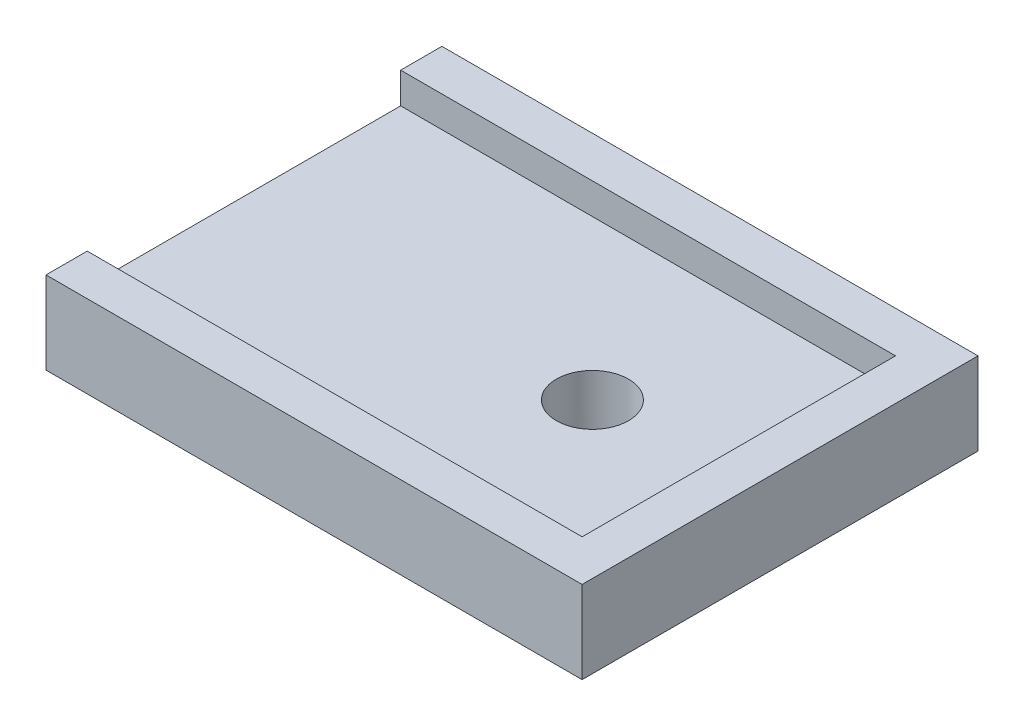
ISO-10303-21;
HEADER;
FILE_DESCRIPTION(('STEP AP214'),'2;1');
FILE_NAME('part.step','',(''),(''),'','','');
FILE_SCHEMA(('AUTOMOTIVE_DESIGN { 1 0 10303 214 1 1 1 1 }'));
ENDSEC;
DATA;
#1=APPLICATION_CONTEXT('core data for automotive mechanical design processes');
#2=APPLICATION_PROTOCOL_DEFINITION('international standard','automotive_design',2000,#1);
#3=PRODUCT_CONTEXT('',#1,'mechanical');
#4=PRODUCT('Part','Part','',(#3));
#5=PRODUCT_RELATED_PRODUCT_CATEGORY('part','',(#4));
#6=PRODUCT_DEFINITION_FORMATION('','',#4);
#7=PRODUCT_DEFINITION_CONTEXT('part definition',#1,'design');
#8=PRODUCT_DEFINITION('design','',#6,#7);
#9=PRODUCT_DEFINITION_SHAPE('','',#8);
#10=(LENGTH_UNIT() NAMED_UNIT(*) SI_UNIT(.MILLI.,.METRE.));
#11=(NAMED_UNIT(*) PLANE_ANGLE_UNIT() SI_UNIT($,.RADIAN.));
#12=(NAMED_UNIT(*) SI_UNIT($,.STERADIAN.) SOLID_ANGLE_UNIT());
#13=UNCERTAINTY_MEASURE_WITH_UNIT(LENGTH_MEASURE(1.E-05),#10,'distance_accuracy_value','');
#14=(GEOMETRIC_REPRESENTATION_CONTEXT(3) GLOBAL_UNCERTAINTY_ASSIGNED_CONTEXT((#13)) GLOBAL_UNIT_ASSIGNED_CONTEXT((#10,
#11,#12)) REPRESENTATION_CONTEXT('',''));
#15=CARTESIAN_POINT('',(0.,0.,0.));
#16=DIRECTION('',(0.,0.,1.));
#17=DIRECTION('',(1.,0.,0.));
#18=AXIS2_PLACEMENT_3D('',#15,#16,#17);
#19=CARTESIAN_POINT('',(-12.,2.5,7.6));
#20=DIRECTION('',(1.,0.,0.));
#21=DIRECTION('',(0.,0.,-1.));
#22=AXIS2_PLACEMENT_3D('',#19,#20,#21);
#23=PLANE('',#22);
#24=DIRECTION('',(0.,0.,1.));
#25=VECTOR('',#24,1.);
#26=CARTESIAN_POINT('',(-12.,0.,7.6));
#27=LINE('',#26,#25);
#28=CARTESIAN_POINT('',(-12.,0.,-9.6));
#29=VERTEX_POINT('',#28);
#30=CARTESIAN_POINT('',(-12.,0.,9.6));
#31=VERTEX_POINT('',#30);
#32=EDGE_CURVE('E192',#29,#31,#27,.T.);
#33=ORIENTED_EDGE('',*,*,#32,.T.);
#34=DIRECTION('',(0.,-1.,0.));
#35=VECTOR('',#34,1.);
#36=CARTESIAN_POINT('',(-12.,4.,9.6));
#37=LINE('',#36,#35);
#38=CARTESIAN_POINT('',(-12.,4.,9.6));
#39=VERTEX_POINT('',#38);
#40=EDGE_CURVE('E166',#39,#31,#37,.T.);
#41=ORIENTED_EDGE('',*,*,#40,.F.);
#42=DIRECTION('',(0.,0.,-1.));
#43=VECTOR('',#42,1.);
#44=CARTESIAN_POINT('',(-12.,4.,9.6));
#45=LINE('',#44,#43);
#46=CARTESIAN_POINT('',(-12.,4.,7.6));
#47=VERTEX_POINT('',#46);
#48=EDGE_CURVE('E111',#39,#47,#45,.T.);
#49=ORIENTED_EDGE('',*,*,#48,.T.);
#50=DIRECTION('',(0.,-1.,0.));
#51=VECTOR('',#50,1.);
#52=CARTESIAN_POINT('',(-12.,4.,7.6));
#53=LINE('',#52,#51);
#54=CARTESIAN_POINT('',(-12.,2.5,7.6));
#55=VERTEX_POINT('',#54);
#56=EDGE_CURVE('E127',#47,#55,#53,.T.);
#57=ORIENTED_EDGE('',*,*,#56,.T.);
#58=DIRECTION('',(0.,0.,1.));
#59=VECTOR('',#58,1.);
#60=CARTESIAN_POINT('',(-12.,2.5,7.6));
#61=LINE('',#60,#59);
#62=CARTESIAN_POINT('',(-12.,2.5,-7.6));
#63=VERTEX_POINT('',#62);
#64=EDGE_CURVE('E48',#63,#55,#61,.T.);
#65=ORIENTED_EDGE('',*,*,#64,.F.);
#66=DIRECTION('',(0.,-1.,0.));
#67=VECTOR('',#66,1.);
#68=CARTESIAN_POINT('',(-12.,4.,-7.6));
#69=LINE('',#68,#67);
#70=CARTESIAN_POINT('',(-12.,4.,-7.6));
#71=VERTEX_POINT('',#70);
#72=EDGE_CURVE('E180',#71,#63,#69,.T.);
#73=ORIENTED_EDGE('',*,*,#72,.F.);
#74=DIRECTION('',(0.,0.,-1.));
#75=VECTOR('',#74,1.);
#76=CARTESIAN_POINT('',(-12.,4.,-7.6));
#77=LINE('',#76,#75);
#78=CARTESIAN_POINT('',(-12.,4.,-9.6));
#79=VERTEX_POINT('',#78);
#80=EDGE_CURVE('E138',#71,#79,#77,.T.);
#81=ORIENTED_EDGE('',*,*,#80,.T.);
#82=DIRECTION('',(0.,-1.,0.));
#83=VECTOR('',#82,1.);
#84=CARTESIAN_POINT('',(-12.,4.,-9.6));
#85=LINE('',#84,#83);
#86=EDGE_CURVE('E176',#79,#29,#85,.T.);
#87=ORIENTED_EDGE('',*,*,#86,.T.);
#88=EDGE_LOOP('',(#33,#41,#49,#57,#65,#73,#81,#87));
#89=FACE_BOUND('',#88,.T.);
#90=ADVANCED_FACE('F39',(#89),#23,.F.);
#91=CARTESIAN_POINT('',(0.,2.5,0.));
#92=DIRECTION('',(0.,-1.,0.));
#93=DIRECTION('',(0.,0.,-1.));
#94=AXIS2_PLACEMENT_3D('',#91,#92,#93);
#95=PLANE('',#94);
#96=CARTESIAN_POINT('',(4.99999999999999,2.5,0.0999999999999812));
#97=DIRECTION('',(0.,1.,0.));
#98=DIRECTION('',(0.,0.,1.));
#99=AXIS2_PLACEMENT_3D('',#96,#97,#98);
#100=CIRCLE('',#99,1.75);
#101=CARTESIAN_POINT('',(4.99999999999999,2.5,1.84999999999998));
#102=VERTEX_POINT('',#101);
#103=EDGE_CURVE('E165',#102,#102,#100,.T.);
#104=ORIENTED_EDGE('',*,*,#103,.F.);
#105=EDGE_LOOP('',(#104));
#106=FACE_BOUND('',#105,.T.);
#107=DIRECTION('',(0.,0.,-1.));
#108=VECTOR('',#107,1.);
#109=CARTESIAN_POINT('',(12.,2.5,7.6));
#110=LINE('',#109,#108);
#111=CARTESIAN_POINT('',(12.,2.5,7.6));
#112=VERTEX_POINT('',#111);
#113=CARTESIAN_POINT('',(12.,2.5,-7.6));
#114=VERTEX_POINT('',#113);
#115=EDGE_CURVE('E106',#112,#114,#110,.T.);
#116=ORIENTED_EDGE('',*,*,#115,.T.);
#117=DIRECTION('',(-1.,0.,0.));
#118=VECTOR('',#117,1.);
#119=CARTESIAN_POINT('',(-12.,2.5,-7.6));
#120=LINE('',#119,#118);
#121=EDGE_CURVE('E191',#114,#63,#120,.T.);
#122=ORIENTED_EDGE('',*,*,#121,.T.);
#123=ORIENTED_EDGE('',*,*,#64,.T.);
#124=DIRECTION('',(1.,0.,0.));
#125=VECTOR('',#124,1.);
#126=CARTESIAN_POINT('',(-12.,2.5,7.6));
#127=LINE('',#126,#125);
#128=EDGE_CURVE('E11',#55,#112,#127,.T.);
#129=ORIENTED_EDGE('',*,*,#128,.T.);
#130=EDGE_LOOP('',(#116,#122,#123,#129));
#131=FACE_BOUND('',#130,.T.);
#132=ADVANCED_FACE('F207',(#106,#131),#95,.F.);
#133=CARTESIAN_POINT('',(0.,0.,0.));
#134=DIRECTION('',(0.,-1.,0.));
#135=DIRECTION('',(0.,0.,-1.));
#136=AXIS2_PLACEMENT_3D('',#133,#134,#135);
#137=PLANE('',#136);
#138=ORIENTED_EDGE('',*,*,#32,.F.);
#139=DIRECTION('',(1.,0.,0.));
#140=VECTOR('',#139,1.);
#141=CARTESIAN_POINT('',(14.,0.,-9.6));
#142=LINE('',#141,#140);
#143=CARTESIAN_POINT('',(14.,0.,-9.6));
#144=VERTEX_POINT('',#143);
#145=EDGE_CURVE('E156',#29,#144,#142,.T.);
#146=ORIENTED_EDGE('',*,*,#145,.T.);
#147=DIRECTION('',(0.,0.,1.));
#148=VECTOR('',#147,1.);
#149=CARTESIAN_POINT('',(14.,0.,9.6));
#150=LINE('',#149,#148);
#151=CARTESIAN_POINT('',(14.,0.,9.6));
#152=VERTEX_POINT('',#151);
#153=EDGE_CURVE('E133',#144,#152,#150,.T.);
#154=ORIENTED_EDGE('',*,*,#153,.T.);
#155=DIRECTION('',(-1.,0.,0.));
#156=VECTOR('',#155,1.);
#157=CARTESIAN_POINT('',(-12.,0.,9.6));
#158=LINE('',#157,#156);
#159=EDGE_CURVE('E129',#152,#31,#158,.T.);
#160=ORIENTED_EDGE('',*,*,#159,.T.);
#161=EDGE_LOOP('',(#138,#146,#154,#160));
#162=FACE_BOUND('',#161,.T.);
#163=CARTESIAN_POINT('',(4.99999999999999,0.,0.0999999999999812));
#164=DIRECTION('',(0.,-1.,0.));
#165=DIRECTION('',(0.,0.,-1.));
#166=AXIS2_PLACEMENT_3D('',#163,#164,#165);
#167=CIRCLE('',#166,1.75);
#168=CARTESIAN_POINT('',(4.99999999999999,0.,-1.65000000000002));
#169=VERTEX_POINT('',#168);
#170=EDGE_CURVE('E42',#169,#169,#167,.T.);
#171=ORIENTED_EDGE('',*,*,#170,.F.);
#172=EDGE_LOOP('',(#171));
#173=FACE_BOUND('',#172,.T.);
#174=ADVANCED_FACE('F205',(#162,#173),#137,.T.);
#175=CARTESIAN_POINT('',(4.99999999999999,-7.5,0.0999999999999812));
#176=DIRECTION('',(0.,1.,0.));
#177=DIRECTION('',(0.,0.,1.));
#178=AXIS2_PLACEMENT_3D('',#175,#176,#177);
#179=CYLINDRICAL_SURFACE('',#178,1.75);
#180=ORIENTED_EDGE('',*,*,#170,.T.);
#181=EDGE_LOOP('',(#180));
#182=FACE_BOUND('',#181,.T.);
#183=ORIENTED_EDGE('',*,*,#103,.T.);
#184=EDGE_LOOP('',(#183));
#185=FACE_BOUND('',#184,.T.);
#186=ADVANCED_FACE('F202',(#182,#185),#179,.F.);
#187=CARTESIAN_POINT('',(-12.,4.,7.6));
#188=DIRECTION('',(0.,0.,-1.));
#189=DIRECTION('',(-1.,0.,0.));
#190=AXIS2_PLACEMENT_3D('',#187,#188,#189);
#191=PLANE('',#190);
#192=ORIENTED_EDGE('',*,*,#128,.F.);
#193=ORIENTED_EDGE('',*,*,#56,.F.);
#194=DIRECTION('',(1.,0.,0.));
#195=VECTOR('',#194,1.);
#196=CARTESIAN_POINT('',(-12.,4.,7.6));
#197=LINE('',#196,#195);
#198=CARTESIAN_POINT('',(12.,4.,7.6));
#199=VERTEX_POINT('',#198);
#200=EDGE_CURVE('E118',#47,#199,#197,.T.);
#201=ORIENTED_EDGE('',*,*,#200,.T.);
#202=DIRECTION('',(0.,-1.,0.));
#203=VECTOR('',#202,1.);
#204=CARTESIAN_POINT('',(12.,4.,7.6));
#205=LINE('',#204,#203);
#206=EDGE_CURVE('E101',#199,#112,#205,.T.);
#207=ORIENTED_EDGE('',*,*,#206,.T.);
#208=EDGE_LOOP('',(#192,#193,#201,#207));
#209=FACE_BOUND('',#208,.T.);
#210=ADVANCED_FACE('F125',(#209),#191,.T.);
#211=CARTESIAN_POINT('',(12.,4.,-7.6));
#212=DIRECTION('',(0.,0.,1.));
#213=DIRECTION('',(1.,0.,0.));
#214=AXIS2_PLACEMENT_3D('',#211,#212,#213);
#215=PLANE('',#214);
#216=ORIENTED_EDGE('',*,*,#121,.F.);
#217=DIRECTION('',(0.,-1.,0.));
#218=VECTOR('',#217,1.);
#219=CARTESIAN_POINT('',(12.,4.,-7.6));
#220=LINE('',#219,#218);
#221=CARTESIAN_POINT('',(12.,4.,-7.6));
#222=VERTEX_POINT('',#221);
#223=EDGE_CURVE('E110',#222,#114,#220,.T.);
#224=ORIENTED_EDGE('',*,*,#223,.F.);
#225=DIRECTION('',(-1.,0.,0.));
#226=VECTOR('',#225,1.);
#227=CARTESIAN_POINT('',(12.,4.,-7.6));
#228=LINE('',#227,#226);
#229=EDGE_CURVE('E122',#222,#71,#228,.T.);
#230=ORIENTED_EDGE('',*,*,#229,.T.);
#231=ORIENTED_EDGE('',*,*,#72,.T.);
#232=EDGE_LOOP('',(#216,#224,#230,#231));
#233=FACE_BOUND('',#232,.T.);
#234=ADVANCED_FACE('F239',(#233),#215,.T.);
#235=CARTESIAN_POINT('',(12.,4.,7.6));
#236=DIRECTION('',(-1.,0.,0.));
#237=DIRECTION('',(0.,0.,1.));
#238=AXIS2_PLACEMENT_3D('',#235,#236,#237);
#239=PLANE('',#238);
#240=ORIENTED_EDGE('',*,*,#115,.F.);
#241=ORIENTED_EDGE('',*,*,#206,.F.);
#242=DIRECTION('',(0.,0.,-1.));
#243=VECTOR('',#242,1.);
#244=CARTESIAN_POINT('',(12.,4.,7.6));
#245=LINE('',#244,#243);
#246=EDGE_CURVE('E105',#199,#222,#245,.T.);
#247=ORIENTED_EDGE('',*,*,#246,.T.);
#248=ORIENTED_EDGE('',*,*,#223,.T.);
#249=EDGE_LOOP('',(#240,#241,#247,#248));
#250=FACE_BOUND('',#249,.T.);
#251=ADVANCED_FACE('F103',(#250),#239,.T.);
#252=CARTESIAN_POINT('',(-12.,4.,9.6));
#253=DIRECTION('',(0.,0.,1.));
#254=DIRECTION('',(1.,0.,0.));
#255=AXIS2_PLACEMENT_3D('',#252,#253,#254);
#256=PLANE('',#255);
#257=ORIENTED_EDGE('',*,*,#159,.F.);
#258=DIRECTION('',(0.,-1.,0.));
#259=VECTOR('',#258,1.);
#260=CARTESIAN_POINT('',(14.,4.,9.6));
#261=LINE('',#260,#259);
#262=CARTESIAN_POINT('',(14.,4.,9.6));
#263=VERTEX_POINT('',#262);
#264=EDGE_CURVE('E170',#263,#152,#261,.T.);
#265=ORIENTED_EDGE('',*,*,#264,.F.);
#266=DIRECTION('',(-1.,0.,0.));
#267=VECTOR('',#266,1.);
#268=CARTESIAN_POINT('',(-12.,4.,9.6));
#269=LINE('',#268,#267);
#270=EDGE_CURVE('E150',#263,#39,#269,.T.);
#271=ORIENTED_EDGE('',*,*,#270,.T.);
#272=ORIENTED_EDGE('',*,*,#40,.T.);
#273=EDGE_LOOP('',(#257,#265,#271,#272));
#274=FACE_BOUND('',#273,.T.);
#275=ADVANCED_FACE('F257',(#274),#256,.T.);
#276=CARTESIAN_POINT('',(14.,4.,9.6));
#277=DIRECTION('',(1.,0.,0.));
#278=DIRECTION('',(0.,0.,-1.));
#279=AXIS2_PLACEMENT_3D('',#276,#277,#278);
#280=PLANE('',#279);
#281=ORIENTED_EDGE('',*,*,#153,.F.);
#282=DIRECTION('',(0.,-1.,0.));
#283=VECTOR('',#282,1.);
#284=CARTESIAN_POINT('',(14.,4.,-9.6));
#285=LINE('',#284,#283);
#286=CARTESIAN_POINT('',(14.,4.,-9.6));
#287=VERTEX_POINT('',#286);
#288=EDGE_CURVE('E173',#287,#144,#285,.T.);
#289=ORIENTED_EDGE('',*,*,#288,.F.);
#290=DIRECTION('',(0.,0.,1.));
#291=VECTOR('',#290,1.);
#292=CARTESIAN_POINT('',(14.,4.,9.6));
#293=LINE('',#292,#291);
#294=EDGE_CURVE('E146',#287,#263,#293,.T.);
#295=ORIENTED_EDGE('',*,*,#294,.T.);
#296=ORIENTED_EDGE('',*,*,#264,.T.);
#297=EDGE_LOOP('',(#281,#289,#295,#296));
#298=FACE_BOUND('',#297,.T.);
#299=ADVANCED_FACE('F266',(#298),#280,.T.);
#300=CARTESIAN_POINT('',(14.,4.,-9.6));
#301=DIRECTION('',(0.,0.,-1.));
#302=DIRECTION('',(-1.,0.,0.));
#303=AXIS2_PLACEMENT_3D('',#300,#301,#302);
#304=PLANE('',#303);
#305=ORIENTED_EDGE('',*,*,#145,.F.);
#306=ORIENTED_EDGE('',*,*,#86,.F.);
#307=DIRECTION('',(1.,0.,0.));
#308=VECTOR('',#307,1.);
#309=CARTESIAN_POINT('',(14.,4.,-9.6));
#310=LINE('',#309,#308);
#311=EDGE_CURVE('E142',#79,#287,#310,.T.);
#312=ORIENTED_EDGE('',*,*,#311,.T.);
#313=ORIENTED_EDGE('',*,*,#288,.T.);
#314=EDGE_LOOP('',(#305,#306,#312,#313));
#315=FACE_BOUND('',#314,.T.);
#316=ADVANCED_FACE('F276',(#315),#304,.T.);
#317=CARTESIAN_POINT('',(0.,4.,0.));
#318=DIRECTION('',(0.,1.,0.));
#319=DIRECTION('',(0.,0.,1.));
#320=AXIS2_PLACEMENT_3D('',#317,#318,#319);
#321=PLANE('',#320);
#322=ORIENTED_EDGE('',*,*,#200,.F.);
#323=ORIENTED_EDGE('',*,*,#48,.F.);
#324=ORIENTED_EDGE('',*,*,#270,.F.);
#325=ORIENTED_EDGE('',*,*,#294,.F.);
#326=ORIENTED_EDGE('',*,*,#311,.F.);
#327=ORIENTED_EDGE('',*,*,#80,.F.);
#328=ORIENTED_EDGE('',*,*,#229,.F.);
#329=ORIENTED_EDGE('',*,*,#246,.F.);
#330=EDGE_LOOP('',(#322,#323,#324,#325,#326,#327,#328,#329));
#331=FACE_BOUND('',#330,.T.);
#332=ADVANCED_FACE('F116',(#331),#321,.T.);
#333=CLOSED_SHELL('',(#90,#132,#174,#186,#210,#234,#251,#275,#299,#316,#332));
#334=MANIFOLD_SOLID_BREP('B2',#333);
#335=ADVANCED_BREP_SHAPE_REPRESENTATION('',(#18,#334),#14);
#336=SHAPE_DEFINITION_REPRESENTATION(#9,#335);
ENDSEC;
END-ISO-10303-21;
